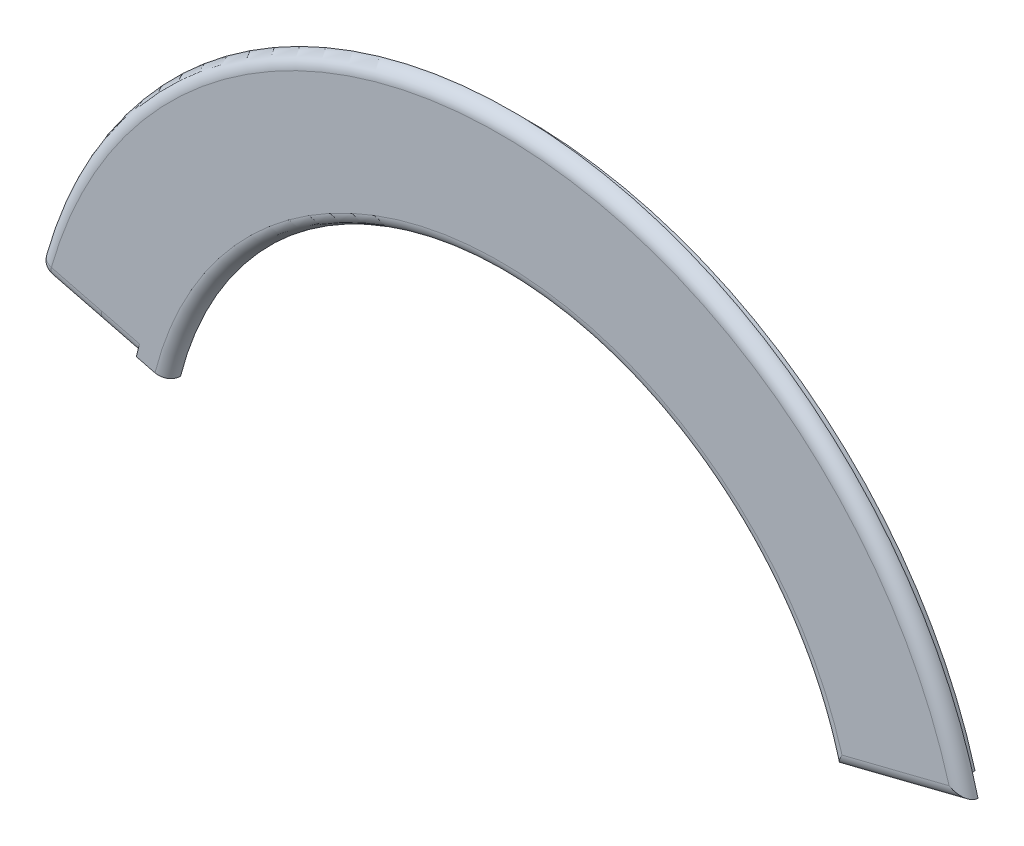
ISO-10303-21;
HEADER;
FILE_DESCRIPTION(('STEP AP214'),'2;1');
FILE_NAME('part.step','',(''),(''),'','','');
FILE_SCHEMA(('AUTOMOTIVE_DESIGN { 1 0 10303 214 1 1 1 1 }'));
ENDSEC;
DATA;
#1=APPLICATION_CONTEXT('core data for automotive mechanical design processes');
#2=APPLICATION_PROTOCOL_DEFINITION('international standard','automotive_design',2000,#1);
#3=PRODUCT_CONTEXT('',#1,'mechanical');
#4=PRODUCT('Part','Part','',(#3));
#5=PRODUCT_RELATED_PRODUCT_CATEGORY('part','',(#4));
#6=PRODUCT_DEFINITION_FORMATION('','',#4);
#7=PRODUCT_DEFINITION_CONTEXT('part definition',#1,'design');
#8=PRODUCT_DEFINITION('design','',#6,#7);
#9=PRODUCT_DEFINITION_SHAPE('','',#8);
#10=(LENGTH_UNIT() NAMED_UNIT(*) SI_UNIT(.MILLI.,.METRE.));
#11=(NAMED_UNIT(*) PLANE_ANGLE_UNIT() SI_UNIT($,.RADIAN.));
#12=(NAMED_UNIT(*) SI_UNIT($,.STERADIAN.) SOLID_ANGLE_UNIT());
#13=UNCERTAINTY_MEASURE_WITH_UNIT(LENGTH_MEASURE(1.E-05),#10,'distance_accuracy_value','');
#14=(GEOMETRIC_REPRESENTATION_CONTEXT(3) GLOBAL_UNCERTAINTY_ASSIGNED_CONTEXT((#13)) GLOBAL_UNIT_ASSIGNED_CONTEXT((#10,
#11,#12)) REPRESENTATION_CONTEXT('',''));
#15=CARTESIAN_POINT('',(0.,0.,0.));
#16=DIRECTION('',(0.,0.,1.));
#17=DIRECTION('',(1.,0.,0.));
#18=AXIS2_PLACEMENT_3D('',#15,#16,#17);
#19=CARTESIAN_POINT('',(-5.49176300543326,4.00359016784074,-7.62));
#20=DIRECTION('',(0.244398834617796,0.969674795814279,0.));
#21=DIRECTION('',(-0.969674795814279,0.244398834617796,0.));
#22=AXIS2_PLACEMENT_3D('',#19,#20,#21);
#23=PLANE('',#22);
#24=DIRECTION('',(-0.969674795814279,0.244398834617796,0.));
#25=VECTOR('',#24,1.);
#26=CARTESIAN_POINT('',(-5.49176300543326,4.00359016784074,0.));
#27=LINE('',#26,#25);
#28=CARTESIAN_POINT('',(-5.49176300543326,4.00359016784074,0.));
#29=VERTEX_POINT('',#28);
#30=CARTESIAN_POINT('',(-12.8806849495381,5.86590928762834,0.));
#31=VERTEX_POINT('',#30);
#32=EDGE_CURVE('E130',#29,#31,#27,.T.);
#33=ORIENTED_EDGE('',*,*,#32,.F.);
#34=DIRECTION('',(0.,0.,1.));
#35=VECTOR('',#34,1.);
#36=CARTESIAN_POINT('',(-5.49176300543326,4.00359016784074,-7.62));
#37=LINE('',#36,#35);
#38=CARTESIAN_POINT('',(-5.49176300543326,4.00359016784074,-7.62));
#39=VERTEX_POINT('',#38);
#40=EDGE_CURVE('E128',#39,#29,#37,.T.);
#41=ORIENTED_EDGE('',*,*,#40,.F.);
#42=DIRECTION('',(-0.969674795814279,0.244398834617796,0.));
#43=VECTOR('',#42,1.);
#44=CARTESIAN_POINT('',(-5.49176300543326,4.00359016784074,-7.62));
#45=LINE('',#44,#43);
#46=CARTESIAN_POINT('',(-12.8806849495381,5.86590928762834,-7.62));
#47=VERTEX_POINT('',#46);
#48=EDGE_CURVE('E113',#39,#47,#45,.T.);
#49=ORIENTED_EDGE('',*,*,#48,.T.);
#50=DIRECTION('',(0.,0.,1.));
#51=VECTOR('',#50,1.);
#52=CARTESIAN_POINT('',(-12.8806849495381,5.86590928762834,-7.62));
#53=LINE('',#52,#51);
#54=EDGE_CURVE('E121',#47,#31,#53,.T.);
#55=ORIENTED_EDGE('',*,*,#54,.T.);
#56=EDGE_LOOP('',(#33,#41,#49,#55));
#57=FACE_BOUND('',#56,.T.);
#58=ADVANCED_FACE('F69',(#57),#23,.T.);
#59=CARTESIAN_POINT('',(-5.49176300543326,4.00359016784074,-7.62));
#60=DIRECTION('',(-0.969674795814279,0.244398834617795,0.));
#61=DIRECTION('',(-0.244398834617795,-0.969674795814279,0.));
#62=AXIS2_PLACEMENT_3D('',#59,#60,#61);
#63=PLANE('',#62);
#64=ORIENTED_EDGE('',*,*,#40,.T.);
#65=CARTESIAN_POINT('',(-5.49176300543326,4.00359016784074,-2.54));
#66=DIRECTION('',(-0.969674795814279,0.244398834617795,0.));
#67=DIRECTION('',(-0.244398834617795,-0.969674795814279,0.));
#68=AXIS2_PLACEMENT_3D('',#65,#66,#67);
#69=CIRCLE('',#68,2.54);
#70=CARTESIAN_POINT('',(-6.11253604536246,1.54061618647247,-2.54));
#71=VERTEX_POINT('',#70);
#72=EDGE_CURVE('E13',#29,#71,#69,.F.);
#73=ORIENTED_EDGE('',*,*,#72,.T.);
#74=DIRECTION('',(0.,0.,1.));
#75=VECTOR('',#74,1.);
#76=CARTESIAN_POINT('',(-6.11253604536246,1.54061618647247,-7.62));
#77=LINE('',#76,#75);
#78=CARTESIAN_POINT('',(-6.11253604536246,1.54061618647247,-7.62));
#79=VERTEX_POINT('',#78);
#80=EDGE_CURVE('E138',#79,#71,#77,.T.);
#81=ORIENTED_EDGE('',*,*,#80,.F.);
#82=DIRECTION('',(-0.244398834617795,-0.969674795814279,0.));
#83=VECTOR('',#82,1.);
#84=CARTESIAN_POINT('',(-5.49176300543326,4.00359016784074,-7.62));
#85=LINE('',#84,#83);
#86=EDGE_CURVE('E126',#39,#79,#85,.T.);
#87=ORIENTED_EDGE('',*,*,#86,.F.);
#88=EDGE_LOOP('',(#64,#73,#81,#87));
#89=FACE_BOUND('',#88,.T.);
#90=ADVANCED_FACE('F149',(#89),#63,.F.);
#91=CARTESIAN_POINT('',(-6.11253604536246,1.54061618647247,-7.62));
#92=DIRECTION('',(0.244398834617796,0.969674795814279,0.));
#93=DIRECTION('',(-0.969674795814279,0.244398834617796,0.));
#94=AXIS2_PLACEMENT_3D('',#91,#92,#93);
#95=PLANE('',#94);
#96=ORIENTED_EDGE('',*,*,#80,.T.);
#97=DIRECTION('',(-0.969674795814279,0.244398834617796,0.));
#98=VECTOR('',#97,1.);
#99=CARTESIAN_POINT('',(-6.11253604536246,1.54061618647247,-2.54));
#100=LINE('',#99,#98);
#101=CARTESIAN_POINT('',(-13.5014579894673,3.40293530626007,-2.54));
#102=VERTEX_POINT('',#101);
#103=EDGE_CURVE('E137',#71,#102,#100,.T.);
#104=ORIENTED_EDGE('',*,*,#103,.T.);
#105=DIRECTION('',(0.,0.,1.));
#106=VECTOR('',#105,1.);
#107=CARTESIAN_POINT('',(-13.5014579894673,3.40293530626007,-7.62));
#108=LINE('',#107,#106);
#109=CARTESIAN_POINT('',(-13.5014579894673,3.40293530626007,-7.62));
#110=VERTEX_POINT('',#109);
#111=EDGE_CURVE('E125',#110,#102,#108,.T.);
#112=ORIENTED_EDGE('',*,*,#111,.F.);
#113=DIRECTION('',(-0.969674795814279,0.244398834617796,0.));
#114=VECTOR('',#113,1.);
#115=CARTESIAN_POINT('',(-6.11253604536246,1.54061618647247,-7.62));
#116=LINE('',#115,#114);
#117=EDGE_CURVE('E115',#79,#110,#116,.T.);
#118=ORIENTED_EDGE('',*,*,#117,.F.);
#119=EDGE_LOOP('',(#96,#104,#112,#118));
#120=FACE_BOUND('',#119,.T.);
#121=ADVANCED_FACE('F142',(#120),#95,.F.);
#122=CARTESIAN_POINT('',(-13.5014579894673,3.40293530626007,-7.62));
#123=DIRECTION('',(0.969674795814279,-0.244398834617795,0.));
#124=DIRECTION('',(0.244398834617795,0.969674795814279,0.));
#125=AXIS2_PLACEMENT_3D('',#122,#123,#124);
#126=PLANE('',#125);
#127=ORIENTED_EDGE('',*,*,#111,.T.);
#128=CARTESIAN_POINT('',(-12.8806849495381,5.86590928762834,-2.54));
#129=DIRECTION('',(0.969674795814279,-0.244398834617795,0.));
#130=DIRECTION('',(0.244398834617795,0.969674795814279,0.));
#131=AXIS2_PLACEMENT_3D('',#128,#129,#130);
#132=CIRCLE('',#131,2.54);
#133=EDGE_CURVE('E77',#102,#31,#132,.F.);
#134=ORIENTED_EDGE('',*,*,#133,.T.);
#135=ORIENTED_EDGE('',*,*,#54,.F.);
#136=DIRECTION('',(0.244398834617795,0.969674795814279,0.));
#137=VECTOR('',#136,1.);
#138=CARTESIAN_POINT('',(-13.5014579894673,3.40293530626007,-7.62));
#139=LINE('',#138,#137);
#140=EDGE_CURVE('E109',#110,#47,#139,.T.);
#141=ORIENTED_EDGE('',*,*,#140,.F.);
#142=EDGE_LOOP('',(#127,#134,#135,#141));
#143=FACE_BOUND('',#142,.T.);
#144=ADVANCED_FACE('F122',(#143),#126,.F.);
#145=CARTESIAN_POINT('',(0.,0.,-7.62));
#146=DIRECTION('',(0.,0.,-1.));
#147=DIRECTION('',(-1.,0.,0.));
#148=AXIS2_PLACEMENT_3D('',#145,#146,#147);
#149=PLANE('',#148);
#150=ORIENTED_EDGE('',*,*,#48,.F.);
#151=ORIENTED_EDGE('',*,*,#86,.T.);
#152=ORIENTED_EDGE('',*,*,#117,.T.);
#153=ORIENTED_EDGE('',*,*,#140,.T.);
#154=EDGE_LOOP('',(#150,#151,#152,#153));
#155=FACE_BOUND('',#154,.T.);
#156=ADVANCED_FACE('F111',(#155),#149,.T.);
#157=CARTESIAN_POINT('',(-5.49176300543326,4.00359016784074,-2.54));
#158=DIRECTION('',(-0.969674795814279,0.244398834617796,0.));
#159=DIRECTION('',(-0.244398834617796,-0.969674795814279,0.));
#160=AXIS2_PLACEMENT_3D('',#157,#158,#159);
#161=CYLINDRICAL_SURFACE('',#160,2.54);
#162=ORIENTED_EDGE('',*,*,#72,.F.);
#163=ORIENTED_EDGE('',*,*,#32,.T.);
#164=ORIENTED_EDGE('',*,*,#133,.F.);
#165=ORIENTED_EDGE('',*,*,#103,.F.);
#166=EDGE_LOOP('',(#162,#163,#164,#165));
#167=FACE_BOUND('',#166,.T.);
#168=ADVANCED_FACE('F71',(#167),#161,.T.);
#169=CLOSED_SHELL('',(#58,#90,#121,#144,#156,#168));
#170=MANIFOLD_SOLID_BREP('B2',#169);
#171=CARTESIAN_POINT('',(-12.880684949538,5.86590928762834,-2.54));
#172=DIRECTION('',(-0.969674795814278,0.2443988346178,0.));
#173=DIRECTION('',(-0.2443988346178,-0.969674795814278,0.));
#174=AXIS2_PLACEMENT_3D('',#171,#172,#173);
#175=PLANE('',#174);
#176=DIRECTION('',(0.,0.,1.));
#177=VECTOR('',#176,1.);
#178=CARTESIAN_POINT('',(-12.880684949538,5.86590928762834,-2.54));
#179=LINE('',#178,#177);
#180=CARTESIAN_POINT('',(-12.880684949538,5.86590928762835,-2.54));
#181=VERTEX_POINT('',#180);
#182=CARTESIAN_POINT('',(-12.8806849495381,5.86590928762835,0.));
#183=VERTEX_POINT('',#182);
#184=EDGE_CURVE('E398',#181,#183,#179,.T.);
#185=ORIENTED_EDGE('',*,*,#184,.T.);
#186=CARTESIAN_POINT('',(-12.880684949538,5.86590928762834,-2.54));
#187=DIRECTION('',(-0.969674795814278,0.2443988346178,0.));
#188=DIRECTION('',(-0.2443988346178,-0.969674795814278,0.));
#189=AXIS2_PLACEMENT_3D('',#186,#187,#188);
#190=CIRCLE('',#189,2.54);
#191=CARTESIAN_POINT('',(-13.5014579894673,3.40293530626007,-2.54));
#192=VERTEX_POINT('',#191);
#193=EDGE_CURVE('E407',#183,#192,#190,.F.);
#194=ORIENTED_EDGE('',*,*,#193,.T.);
#195=DIRECTION('',(-0.2443988346178,-0.969674795814278,0.));
#196=VECTOR('',#195,1.);
#197=CARTESIAN_POINT('',(-12.880684949538,5.86590928762834,-2.54));
#198=LINE('',#197,#196);
#199=EDGE_CURVE('E383',#181,#192,#198,.T.);
#200=ORIENTED_EDGE('',*,*,#199,.F.);
#201=EDGE_LOOP('',(#185,#194,#200));
#202=FACE_BOUND('',#201,.T.);
#203=ADVANCED_FACE('F193',(#202),#175,.F.);
#204=CARTESIAN_POINT('',(0.,0.,-2.54));
#205=DIRECTION('',(0.244398834617798,0.969674795814278,0.));
#206=DIRECTION('',(-0.969674795814278,0.244398834617798,0.));
#207=AXIS2_PLACEMENT_3D('',#204,#205,#206);
#208=PLANE('',#207);
#209=DIRECTION('',(-0.969674795814278,0.244398834617798,0.));
#210=VECTOR('',#209,1.);
#211=CARTESIAN_POINT('',(0.,0.,-2.54));
#212=LINE('',#211,#210);
#213=CARTESIAN_POINT('',(0.,0.,-2.54));
#214=VERTEX_POINT('',#213);
#215=CARTESIAN_POINT('',(-6.11253604536246,1.54061618647247,-2.54));
#216=VERTEX_POINT('',#215);
#217=EDGE_CURVE('E372',#214,#216,#212,.T.);
#218=ORIENTED_EDGE('',*,*,#217,.F.);
#219=CARTESIAN_POINT('',(-2.46297398136827,0.620773039929218,-2.54));
#220=DIRECTION('',(0.244398834617798,0.969674795814278,0.));
#221=DIRECTION('',(-0.969674795814278,0.244398834617798,0.));
#222=AXIS2_PLACEMENT_3D('',#219,#220,#221);
#223=CIRCLE('',#222,2.54);
#224=CARTESIAN_POINT('',(-2.46297398136829,0.620773039929211,0.));
#225=VERTEX_POINT('',#224);
#226=EDGE_CURVE('E414',#214,#225,#223,.F.);
#227=ORIENTED_EDGE('',*,*,#226,.T.);
#228=DIRECTION('',(-0.969674795814278,0.244398834617798,0.));
#229=VECTOR('',#228,1.);
#230=CARTESIAN_POINT('',(0.,0.,0.));
#231=LINE('',#230,#229);
#232=CARTESIAN_POINT('',(-6.11253604536246,1.54061618647247,0.));
#233=VERTEX_POINT('',#232);
#234=EDGE_CURVE('E369',#225,#233,#231,.T.);
#235=ORIENTED_EDGE('',*,*,#234,.T.);
#236=DIRECTION('',(0.,0.,1.));
#237=VECTOR('',#236,1.);
#238=CARTESIAN_POINT('',(-6.11253604536246,1.54061618647247,-2.54));
#239=LINE('',#238,#237);
#240=EDGE_CURVE('E402',#216,#233,#239,.T.);
#241=ORIENTED_EDGE('',*,*,#240,.F.);
#242=EDGE_LOOP('',(#218,#227,#235,#241));
#243=FACE_BOUND('',#242,.T.);
#244=ADVANCED_FACE('F442',(#243),#208,.F.);
#245=CARTESIAN_POINT('',(-6.11253604536246,1.54061618647247,-2.54));
#246=DIRECTION('',(0.969674795814278,-0.244398834617798,0.));
#247=DIRECTION('',(0.244398834617798,0.969674795814278,0.));
#248=AXIS2_PLACEMENT_3D('',#245,#246,#247);
#249=PLANE('',#248);
#250=DIRECTION('',(0.244398834617798,0.969674795814278,0.));
#251=VECTOR('',#250,1.);
#252=CARTESIAN_POINT('',(-6.11253604536246,1.54061618647247,0.));
#253=LINE('',#252,#251);
#254=CARTESIAN_POINT('',(-5.49176300543325,4.00359016784073,0.));
#255=VERTEX_POINT('',#254);
#256=EDGE_CURVE('E365',#233,#255,#253,.T.);
#257=ORIENTED_EDGE('',*,*,#256,.T.);
#258=DIRECTION('',(0.,0.,1.));
#259=VECTOR('',#258,1.);
#260=CARTESIAN_POINT('',(-5.49176300543325,4.00359016784074,-2.54));
#261=LINE('',#260,#259);
#262=CARTESIAN_POINT('',(-5.49176300543325,4.00359016784073,-2.54));
#263=VERTEX_POINT('',#262);
#264=EDGE_CURVE('E394',#263,#255,#261,.T.);
#265=ORIENTED_EDGE('',*,*,#264,.F.);
#266=DIRECTION('',(0.244398834617798,0.969674795814278,0.));
#267=VECTOR('',#266,1.);
#268=CARTESIAN_POINT('',(-6.11253604536246,1.54061618647247,-2.54));
#269=LINE('',#268,#267);
#270=EDGE_CURVE('E368',#216,#263,#269,.T.);
#271=ORIENTED_EDGE('',*,*,#270,.F.);
#272=ORIENTED_EDGE('',*,*,#240,.T.);
#273=EDGE_LOOP('',(#257,#265,#271,#272));
#274=FACE_BOUND('',#273,.T.);
#275=ADVANCED_FACE('F448',(#274),#249,.F.);
#276=CARTESIAN_POINT('',(65.1139115965482,-16.411444517581,-2.54));
#277=DIRECTION('',(0.,0.,1.));
#278=DIRECTION('',(1.,0.,0.));
#279=AXIS2_PLACEMENT_3D('',#276,#277,#278);
#280=PLANE('',#279);
#281=DIRECTION('',(-0.969674795814278,0.2443988346178,0.));
#282=VECTOR('',#281,1.);
#283=CARTESIAN_POINT('',(-13.5014579894673,3.40293530626007,-2.54));
#284=LINE('',#283,#282);
#285=CARTESIAN_POINT('',(-23.3639783500367,5.88870527050193,-2.54));
#286=VERTEX_POINT('',#285);
#287=EDGE_CURVE('E380',#192,#286,#284,.T.);
#288=ORIENTED_EDGE('',*,*,#287,.T.);
#289=CARTESIAN_POINT('',(-22.7432053101074,8.3516792518702,-2.54));
#290=DIRECTION('',(0.,0.,1.));
#291=DIRECTION('',(1.,0.,0.));
#292=AXIS2_PLACEMENT_3D('',#289,#290,#291);
#293=CIRCLE('',#292,2.54);
#294=CARTESIAN_POINT('',(-25.1879516841023,9.04074758435909,-2.54));
#295=VERTEX_POINT('',#294);
#296=EDGE_CURVE('E412',#286,#295,#293,.F.);
#297=ORIENTED_EDGE('',*,*,#296,.T.);
#298=CARTESIAN_POINT('',(65.1139115965482,-16.411444517581,-2.54));
#299=DIRECTION('',(0.,0.,-1.));
#300=DIRECTION('',(-1.,0.,0.));
#301=AXIS2_PLACEMENT_3D('',#298,#299,#300);
#302=CIRCLE('',#301,93.8202568465433);
#303=CARTESIAN_POINT('',(156.089049997463,6.51811691925664,-2.54));
#304=VERTEX_POINT('',#303);
#305=EDGE_CURVE('E378',#295,#304,#302,.T.);
#306=ORIENTED_EDGE('',*,*,#305,.T.);
#307=DIRECTION('',(-0.969674795814278,-0.244398834617797,0.));
#308=VECTOR('',#307,1.);
#309=CARTESIAN_POINT('',(130.227823193096,0.,-2.54));
#310=LINE('',#309,#308);
#311=CARTESIAN_POINT('',(130.227823193096,0.,-2.54));
#312=VERTEX_POINT('',#311);
#313=EDGE_CURVE('E376',#304,#312,#310,.T.);
#314=ORIENTED_EDGE('',*,*,#313,.T.);
#315=CARTESIAN_POINT('',(65.1139115965482,-16.411444517581,-2.54));
#316=DIRECTION('',(0.,0.,1.));
#317=DIRECTION('',(-1.,0.,0.));
#318=AXIS2_PLACEMENT_3D('',#315,#316,#317);
#319=CIRCLE('',#318,67.1502568465433);
#320=EDGE_CURVE('E374',#312,#214,#319,.T.);
#321=ORIENTED_EDGE('',*,*,#320,.T.);
#322=ORIENTED_EDGE('',*,*,#217,.T.);
#323=ORIENTED_EDGE('',*,*,#270,.T.);
#324=DIRECTION('',(-0.969674795814278,0.244398834617798,0.));
#325=VECTOR('',#324,1.);
#326=CARTESIAN_POINT('',(0.620773039929206,2.46297398136827,-2.54));
#327=LINE('',#326,#325);
#328=CARTESIAN_POINT('',(-1.79730203338088,3.07243060794693,-2.54));
#329=VERTEX_POINT('',#328);
#330=EDGE_CURVE('E366',#329,#263,#327,.T.);
#331=ORIENTED_EDGE('',*,*,#330,.F.);
#332=CARTESIAN_POINT('',(65.1139115965482,-16.411444517581,-2.54));
#333=DIRECTION('',(0.,0.,1.));
#334=DIRECTION('',(1.,0.,0.));
#335=AXIS2_PLACEMENT_3D('',#332,#333,#334);
#336=CIRCLE('',#335,69.6902568465433);
#337=CARTESIAN_POINT('',(132.025125226477,3.07243060794694,-2.54));
#338=VERTEX_POINT('',#337);
#339=EDGE_CURVE('E392',#338,#329,#336,.T.);
#340=ORIENTED_EDGE('',*,*,#339,.F.);
#341=DIRECTION('',(-0.969674795814279,-0.244398834617797,0.));
#342=VECTOR('',#341,1.);
#343=CARTESIAN_POINT('',(129.607050153167,2.46297398136827,-2.54));
#344=LINE('',#343,#342);
#345=CARTESIAN_POINT('',(152.971028503204,8.35167925187016,-2.54));
#346=VERTEX_POINT('',#345);
#347=EDGE_CURVE('E390',#346,#338,#344,.T.);
#348=ORIENTED_EDGE('',*,*,#347,.F.);
#349=CARTESIAN_POINT('',(65.1139115965482,-16.411444517581,-2.54));
#350=DIRECTION('',(0.,0.,1.));
#351=DIRECTION('',(1.,0.,0.));
#352=AXIS2_PLACEMENT_3D('',#349,#350,#351);
#353=CIRCLE('',#352,91.2802568465433);
#354=CARTESIAN_POINT('',(-22.7432053101075,8.35167925187018,-2.54));
#355=VERTEX_POINT('',#354);
#356=EDGE_CURVE('E388',#355,#346,#353,.F.);
#357=ORIENTED_EDGE('',*,*,#356,.F.);
#358=DIRECTION('',(-0.969674795814278,0.2443988346178,0.));
#359=VECTOR('',#358,1.);
#360=CARTESIAN_POINT('',(-12.880684949538,5.86590928762834,-2.54));
#361=LINE('',#360,#359);
#362=EDGE_CURVE('E386',#181,#355,#361,.T.);
#363=ORIENTED_EDGE('',*,*,#362,.F.);
#364=ORIENTED_EDGE('',*,*,#199,.T.);
#365=EDGE_LOOP('',(#288,#297,#306,#314,#321,#322,#323,#331,#340,#348,#357,#363,#364));
#366=FACE_BOUND('',#365,.T.);
#367=ADVANCED_FACE('F457',(#366),#280,.F.);
#368=CARTESIAN_POINT('',(65.1139115965482,-16.411444517581,0.));
#369=DIRECTION('',(0.,0.,1.));
#370=DIRECTION('',(1.,0.,0.));
#371=AXIS2_PLACEMENT_3D('',#368,#369,#370);
#372=PLANE('',#371);
#373=ORIENTED_EDGE('',*,*,#234,.F.);
#374=CARTESIAN_POINT('',(65.1139115965482,-16.411444517581,0.));
#375=DIRECTION('',(0.,0.,1.));
#376=DIRECTION('',(1.,0.,0.));
#377=AXIS2_PLACEMENT_3D('',#374,#375,#376);
#378=CIRCLE('',#377,69.6902568465433);
#379=CARTESIAN_POINT('',(132.025125226477,3.07243060794694,0.));
#380=VERTEX_POINT('',#379);
#381=EDGE_CURVE('E67',#225,#380,#378,.F.);
#382=ORIENTED_EDGE('',*,*,#381,.T.);
#383=DIRECTION('',(-0.969674795814279,-0.244398834617797,0.));
#384=VECTOR('',#383,1.);
#385=CARTESIAN_POINT('',(155.468276957534,8.98109090062491,0.));
#386=LINE('',#385,#384);
#387=CARTESIAN_POINT('',(152.971028503204,8.35167925187016,0.));
#388=VERTEX_POINT('',#387);
#389=EDGE_CURVE('E208',#380,#388,#386,.F.);
#390=ORIENTED_EDGE('',*,*,#389,.T.);
#391=CARTESIAN_POINT('',(65.1139115965482,-16.411444517581,0.));
#392=DIRECTION('',(0.,0.,1.));
#393=DIRECTION('',(1.,0.,0.));
#394=AXIS2_PLACEMENT_3D('',#391,#392,#393);
#395=CIRCLE('',#394,91.2802568465433);
#396=CARTESIAN_POINT('',(-22.7432053101074,8.3516792518702,0.));
#397=VERTEX_POINT('',#396);
#398=EDGE_CURVE('E416',#388,#397,#395,.T.);
#399=ORIENTED_EDGE('',*,*,#398,.T.);
#400=DIRECTION('',(-0.969674795814278,0.2443988346178,0.));
#401=VECTOR('',#400,1.);
#402=CARTESIAN_POINT('',(-12.880684949538,5.86590928762834,0.));
#403=LINE('',#402,#401);
#404=EDGE_CURVE('E401',#397,#183,#403,.F.);
#405=ORIENTED_EDGE('',*,*,#404,.T.);
#406=DIRECTION('',(-0.969674795814279,0.244398834617797,0.));
#407=VECTOR('',#406,1.);
#408=CARTESIAN_POINT('',(-1.79730203338088,3.07243060794693,0.));
#409=LINE('',#408,#407);
#410=EDGE_CURVE('E334',#255,#183,#409,.T.);
#411=ORIENTED_EDGE('',*,*,#410,.F.);
#412=ORIENTED_EDGE('',*,*,#256,.F.);
#413=EDGE_LOOP('',(#373,#382,#390,#399,#405,#411,#412));
#414=FACE_BOUND('',#413,.T.);
#415=ADVANCED_FACE('F452',(#414),#372,.T.);
#416=CARTESIAN_POINT('',(-1.79730203338088,3.07243060794693,-5.08));
#417=DIRECTION('',(0.244398834617797,0.969674795814279,0.));
#418=DIRECTION('',(-0.969674795814279,0.244398834617797,0.));
#419=AXIS2_PLACEMENT_3D('',#416,#417,#418);
#420=PLANE('',#419);
#421=ORIENTED_EDGE('',*,*,#330,.T.);
#422=ORIENTED_EDGE('',*,*,#264,.T.);
#423=ORIENTED_EDGE('',*,*,#410,.T.);
#424=ORIENTED_EDGE('',*,*,#184,.F.);
#425=ORIENTED_EDGE('',*,*,#362,.T.);
#426=DIRECTION('',(0.,0.,1.));
#427=VECTOR('',#426,1.);
#428=CARTESIAN_POINT('',(-22.7432053101075,8.35167925187018,-5.08));
#429=LINE('',#428,#427);
#430=CARTESIAN_POINT('',(-22.7432053101075,8.35167925187018,-5.08));
#431=VERTEX_POINT('',#430);
#432=EDGE_CURVE('E362',#431,#355,#429,.T.);
#433=ORIENTED_EDGE('',*,*,#432,.F.);
#434=DIRECTION('',(-0.969674795814279,0.244398834617797,0.));
#435=VECTOR('',#434,1.);
#436=CARTESIAN_POINT('',(-1.79730203338088,3.07243060794693,-5.08));
#437=LINE('',#436,#435);
#438=CARTESIAN_POINT('',(-1.79730203338088,3.07243060794693,-5.08));
#439=VERTEX_POINT('',#438);
#440=EDGE_CURVE('E337',#439,#431,#437,.T.);
#441=ORIENTED_EDGE('',*,*,#440,.F.);
#442=DIRECTION('',(0.,0.,1.));
#443=VECTOR('',#442,1.);
#444=CARTESIAN_POINT('',(-1.79730203338088,3.07243060794693,-5.08));
#445=LINE('',#444,#443);
#446=EDGE_CURVE('E352',#439,#329,#445,.T.);
#447=ORIENTED_EDGE('',*,*,#446,.T.);
#448=EDGE_LOOP('',(#421,#422,#423,#424,#425,#433,#441,#447));
#449=FACE_BOUND('',#448,.T.);
#450=ADVANCED_FACE('F491',(#449),#420,.F.);
#451=CARTESIAN_POINT('',(65.1139115965482,-16.411444517581,-5.08));
#452=DIRECTION('',(0.,0.,1.));
#453=DIRECTION('',(1.,0.,0.));
#454=AXIS2_PLACEMENT_3D('',#451,#452,#453);
#455=CYLINDRICAL_SURFACE('',#454,91.2802568465433);
#456=ORIENTED_EDGE('',*,*,#432,.T.);
#457=ORIENTED_EDGE('',*,*,#356,.T.);
#458=DIRECTION('',(0.,0.,1.));
#459=VECTOR('',#458,1.);
#460=CARTESIAN_POINT('',(152.971028503204,8.35167925187016,-5.08));
#461=LINE('',#460,#459);
#462=CARTESIAN_POINT('',(152.971028503204,8.35167925187016,-5.08));
#463=VERTEX_POINT('',#462);
#464=EDGE_CURVE('E359',#463,#346,#461,.T.);
#465=ORIENTED_EDGE('',*,*,#464,.F.);
#466=CARTESIAN_POINT('',(65.1139115965482,-16.411444517581,-5.08));
#467=DIRECTION('',(0.,0.,-1.));
#468=DIRECTION('',(-1.,0.,0.));
#469=AXIS2_PLACEMENT_3D('',#466,#467,#468);
#470=CIRCLE('',#469,91.2802568465433);
#471=EDGE_CURVE('E345',#431,#463,#470,.T.);
#472=ORIENTED_EDGE('',*,*,#471,.F.);
#473=EDGE_LOOP('',(#456,#457,#465,#472));
#474=FACE_BOUND('',#473,.T.);
#475=ADVANCED_FACE('F505',(#474),#455,.T.);
#476=CARTESIAN_POINT('',(132.025125226477,3.07243060794694,-5.08));
#477=DIRECTION('',(0.244398834617797,-0.969674795814279,0.));
#478=DIRECTION('',(0.969674795814279,0.244398834617797,0.));
#479=AXIS2_PLACEMENT_3D('',#476,#477,#478);
#480=PLANE('',#479);
#481=ORIENTED_EDGE('',*,*,#347,.T.);
#482=DIRECTION('',(0.,0.,1.));
#483=VECTOR('',#482,1.);
#484=CARTESIAN_POINT('',(132.025125226477,3.07243060794694,-5.08));
#485=LINE('',#484,#483);
#486=CARTESIAN_POINT('',(132.025125226477,3.07243060794694,-5.08));
#487=VERTEX_POINT('',#486);
#488=EDGE_CURVE('E356',#487,#338,#485,.T.);
#489=ORIENTED_EDGE('',*,*,#488,.F.);
#490=DIRECTION('',(0.969674795814278,0.244398834617797,0.));
#491=VECTOR('',#490,1.);
#492=CARTESIAN_POINT('',(132.025125226477,3.07243060794694,-5.08));
#493=LINE('',#492,#491);
#494=EDGE_CURVE('E347',#487,#463,#493,.T.);
#495=ORIENTED_EDGE('',*,*,#494,.T.);
#496=ORIENTED_EDGE('',*,*,#464,.T.);
#497=EDGE_LOOP('',(#481,#489,#495,#496));
#498=FACE_BOUND('',#497,.T.);
#499=ADVANCED_FACE('F499',(#498),#480,.T.);
#500=CARTESIAN_POINT('',(65.1139115965482,-16.411444517581,-5.08));
#501=DIRECTION('',(0.,0.,1.));
#502=DIRECTION('',(1.,0.,0.));
#503=AXIS2_PLACEMENT_3D('',#500,#501,#502);
#504=CYLINDRICAL_SURFACE('',#503,69.6902568465433);
#505=ORIENTED_EDGE('',*,*,#339,.T.);
#506=ORIENTED_EDGE('',*,*,#446,.F.);
#507=CARTESIAN_POINT('',(65.1139115965482,-16.411444517581,-5.08));
#508=DIRECTION('',(0.,0.,-1.));
#509=DIRECTION('',(-1.,0.,0.));
#510=AXIS2_PLACEMENT_3D('',#507,#508,#509);
#511=CIRCLE('',#510,69.6902568465433);
#512=EDGE_CURVE('E350',#439,#487,#511,.T.);
#513=ORIENTED_EDGE('',*,*,#512,.T.);
#514=ORIENTED_EDGE('',*,*,#488,.T.);
#515=EDGE_LOOP('',(#505,#506,#513,#514));
#516=FACE_BOUND('',#515,.T.);
#517=ADVANCED_FACE('F496',(#516),#504,.F.);
#518=CARTESIAN_POINT('',(65.1139115965482,-16.411444517581,-5.08));
#519=DIRECTION('',(0.,0.,-1.));
#520=DIRECTION('',(-1.,0.,0.));
#521=AXIS2_PLACEMENT_3D('',#518,#519,#520);
#522=PLANE('',#521);
#523=ORIENTED_EDGE('',*,*,#440,.T.);
#524=ORIENTED_EDGE('',*,*,#471,.T.);
#525=ORIENTED_EDGE('',*,*,#494,.F.);
#526=ORIENTED_EDGE('',*,*,#512,.F.);
#527=EDGE_LOOP('',(#523,#524,#525,#526));
#528=FACE_BOUND('',#527,.T.);
#529=CARTESIAN_POINT('',(65.1139115965482,-16.411444517581,-5.08));
#530=DIRECTION('',(0.,0.,-1.));
#531=DIRECTION('',(-1.,0.,0.));
#532=AXIS2_PLACEMENT_3D('',#529,#530,#531);
#533=CIRCLE('',#532,88.7402568465433);
#534=CARTESIAN_POINT('',(-19.5526223378407,10.166953039974,-5.08));
#535=VERTEX_POINT('',#534);
#536=CARTESIAN_POINT('',(149.780445530937,10.166953039974,-5.08));
#537=VERTEX_POINT('',#536);
#538=EDGE_CURVE('E550',#535,#537,#533,.T.);
#539=ORIENTED_EDGE('',*,*,#538,.F.);
#540=DIRECTION('',(-0.969674795814278,0.244398834617797,0.));
#541=VECTOR('',#540,1.);
#542=CARTESIAN_POINT('',(-3.5109646146535,6.12378055595348,-5.08));
#543=LINE('',#542,#541);
#544=CARTESIAN_POINT('',(-3.51096461465351,6.12378055595348,-5.08));
#545=VERTEX_POINT('',#544);
#546=EDGE_CURVE('E333',#545,#535,#543,.T.);
#547=ORIENTED_EDGE('',*,*,#546,.F.);
#548=CARTESIAN_POINT('',(65.1139115965482,-16.411444517581,-5.08));
#549=DIRECTION('',(0.,0.,-1.));
#550=DIRECTION('',(-1.,0.,0.));
#551=AXIS2_PLACEMENT_3D('',#548,#549,#550);
#552=CIRCLE('',#551,72.2302568465433);
#553=CARTESIAN_POINT('',(133.73878780775,6.1237805559535,-5.08));
#554=VERTEX_POINT('',#553);
#555=EDGE_CURVE('E543',#545,#554,#552,.T.);
#556=ORIENTED_EDGE('',*,*,#555,.T.);
#557=DIRECTION('',(0.969674795814278,0.244398834617797,0.));
#558=VECTOR('',#557,1.);
#559=CARTESIAN_POINT('',(133.73878780775,6.12378055595348,-5.08));
#560=LINE('',#559,#558);
#561=EDGE_CURVE('E545',#554,#537,#560,.T.);
#562=ORIENTED_EDGE('',*,*,#561,.T.);
#563=EDGE_LOOP('',(#539,#547,#556,#562));
#564=FACE_BOUND('',#563,.T.);
#565=ADVANCED_FACE('F501',(#528,#564),#522,.T.);
#566=CARTESIAN_POINT('',(-3.5109646146535,6.12378055595348,-5.08));
#567=DIRECTION('',(0.244398834617797,0.969674795814278,0.));
#568=DIRECTION('',(-0.969674795814279,0.244398834617797,0.));
#569=AXIS2_PLACEMENT_3D('',#566,#567,#568);
#570=PLANE('',#569);
#571=DIRECTION('',(-0.969674795814278,0.244398834617797,0.));
#572=VECTOR('',#571,1.);
#573=CARTESIAN_POINT('',(-3.5109646146535,6.12378055595348,-2.54));
#574=LINE('',#573,#572);
#575=CARTESIAN_POINT('',(-3.51096461465351,6.12378055595348,-2.54));
#576=VERTEX_POINT('',#575);
#577=CARTESIAN_POINT('',(-19.5526223378407,10.166953039974,-2.54));
#578=VERTEX_POINT('',#577);
#579=EDGE_CURVE('E310',#576,#578,#574,.T.);
#580=ORIENTED_EDGE('',*,*,#579,.F.);
#581=DIRECTION('',(0.,0.,1.));
#582=VECTOR('',#581,1.);
#583=CARTESIAN_POINT('',(-3.51096461465351,6.12378055595348,-5.08));
#584=LINE('',#583,#582);
#585=EDGE_CURVE('E539',#545,#576,#584,.T.);
#586=ORIENTED_EDGE('',*,*,#585,.F.);
#587=ORIENTED_EDGE('',*,*,#546,.T.);
#588=DIRECTION('',(0.,0.,1.));
#589=VECTOR('',#588,1.);
#590=CARTESIAN_POINT('',(-19.5526223378407,10.166953039974,-5.08));
#591=LINE('',#590,#589);
#592=EDGE_CURVE('E325',#535,#578,#591,.T.);
#593=ORIENTED_EDGE('',*,*,#592,.T.);
#594=EDGE_LOOP('',(#580,#586,#587,#593));
#595=FACE_BOUND('',#594,.T.);
#596=ADVANCED_FACE('F331',(#595),#570,.T.);
#597=CARTESIAN_POINT('',(65.1139115965482,-16.411444517581,-5.08));
#598=DIRECTION('',(0.,0.,1.));
#599=DIRECTION('',(1.,0.,0.));
#600=AXIS2_PLACEMENT_3D('',#597,#598,#599);
#601=CYLINDRICAL_SURFACE('',#600,88.7402568465433);
#602=CARTESIAN_POINT('',(65.1139115965482,-16.411444517581,-2.54));
#603=DIRECTION('',(0.,0.,-1.));
#604=DIRECTION('',(-1.,0.,0.));
#605=AXIS2_PLACEMENT_3D('',#602,#603,#604);
#606=CIRCLE('',#605,88.7402568465433);
#607=CARTESIAN_POINT('',(149.780445530937,10.166953039974,-2.54));
#608=VERTEX_POINT('',#607);
#609=EDGE_CURVE('E313',#578,#608,#606,.T.);
#610=ORIENTED_EDGE('',*,*,#609,.F.);
#611=ORIENTED_EDGE('',*,*,#592,.F.);
#612=ORIENTED_EDGE('',*,*,#538,.T.);
#613=DIRECTION('',(0.,0.,1.));
#614=VECTOR('',#613,1.);
#615=CARTESIAN_POINT('',(149.780445530937,10.166953039974,-5.08));
#616=LINE('',#615,#614);
#617=EDGE_CURVE('E328',#537,#608,#616,.T.);
#618=ORIENTED_EDGE('',*,*,#617,.T.);
#619=EDGE_LOOP('',(#610,#611,#612,#618));
#620=FACE_BOUND('',#619,.T.);
#621=ADVANCED_FACE('F324',(#620),#601,.F.);
#622=CARTESIAN_POINT('',(133.73878780775,6.12378055595348,-5.08));
#623=DIRECTION('',(0.244398834617797,-0.969674795814278,0.));
#624=DIRECTION('',(0.969674795814279,0.244398834617797,0.));
#625=AXIS2_PLACEMENT_3D('',#622,#623,#624);
#626=PLANE('',#625);
#627=DIRECTION('',(0.,0.,1.));
#628=VECTOR('',#627,1.);
#629=CARTESIAN_POINT('',(133.73878780775,6.1237805559535,-5.08));
#630=LINE('',#629,#628);
#631=CARTESIAN_POINT('',(133.73878780775,6.1237805559535,-2.54));
#632=VERTEX_POINT('',#631);
#633=EDGE_CURVE('E339',#554,#632,#630,.T.);
#634=ORIENTED_EDGE('',*,*,#633,.T.);
#635=DIRECTION('',(0.969674795814278,0.244398834617797,0.));
#636=VECTOR('',#635,1.);
#637=CARTESIAN_POINT('',(133.73878780775,6.12378055595348,-2.54));
#638=LINE('',#637,#636);
#639=EDGE_CURVE('E329',#632,#608,#638,.T.);
#640=ORIENTED_EDGE('',*,*,#639,.T.);
#641=ORIENTED_EDGE('',*,*,#617,.F.);
#642=ORIENTED_EDGE('',*,*,#561,.F.);
#643=EDGE_LOOP('',(#634,#640,#641,#642));
#644=FACE_BOUND('',#643,.T.);
#645=ADVANCED_FACE('F530',(#644),#626,.F.);
#646=CARTESIAN_POINT('',(65.1139115965482,-16.411444517581,-5.08));
#647=DIRECTION('',(0.,0.,1.));
#648=DIRECTION('',(1.,0.,0.));
#649=AXIS2_PLACEMENT_3D('',#646,#647,#648);
#650=CYLINDRICAL_SURFACE('',#649,72.2302568465433);
#651=ORIENTED_EDGE('',*,*,#585,.T.);
#652=CARTESIAN_POINT('',(65.1139115965482,-16.411444517581,-2.54));
#653=DIRECTION('',(0.,0.,-1.));
#654=DIRECTION('',(-1.,0.,0.));
#655=AXIS2_PLACEMENT_3D('',#652,#653,#654);
#656=CIRCLE('',#655,72.2302568465433);
#657=EDGE_CURVE('E316',#576,#632,#656,.T.);
#658=ORIENTED_EDGE('',*,*,#657,.T.);
#659=ORIENTED_EDGE('',*,*,#633,.F.);
#660=ORIENTED_EDGE('',*,*,#555,.F.);
#661=EDGE_LOOP('',(#651,#658,#659,#660));
#662=FACE_BOUND('',#661,.T.);
#663=ADVANCED_FACE('F467',(#662),#650,.T.);
#664=CARTESIAN_POINT('',(65.1139115965482,-16.411444517581,-2.54));
#665=DIRECTION('',(0.,0.,-1.));
#666=DIRECTION('',(-1.,0.,0.));
#667=AXIS2_PLACEMENT_3D('',#664,#665,#666);
#668=PLANE('',#667);
#669=ORIENTED_EDGE('',*,*,#579,.T.);
#670=ORIENTED_EDGE('',*,*,#609,.T.);
#671=ORIENTED_EDGE('',*,*,#639,.F.);
#672=ORIENTED_EDGE('',*,*,#657,.F.);
#673=EDGE_LOOP('',(#669,#670,#671,#672));
#674=FACE_BOUND('',#673,.T.);
#675=ADVANCED_FACE('F312',(#674),#668,.T.);
#676=CARTESIAN_POINT('',(-12.880684949538,5.86590928762834,-2.54));
#677=DIRECTION('',(0.969674795814278,-0.2443988346178,0.));
#678=DIRECTION('',(0.2443988346178,0.969674795814278,0.));
#679=AXIS2_PLACEMENT_3D('',#676,#677,#678);
#680=CYLINDRICAL_SURFACE('',#679,2.54);
#681=ORIENTED_EDGE('',*,*,#404,.F.);
#682=CARTESIAN_POINT('',(-22.7432053101074,8.3516792518702,-2.54));
#683=DIRECTION('',(0.969674795814278,-0.2443988346178,0.));
#684=DIRECTION('',(0.2443988346178,0.969674795814278,0.));
#685=AXIS2_PLACEMENT_3D('',#682,#683,#684);
#686=CIRCLE('',#685,2.54);
#687=EDGE_CURVE('E409',#397,#286,#686,.T.);
#688=ORIENTED_EDGE('',*,*,#687,.T.);
#689=ORIENTED_EDGE('',*,*,#287,.F.);
#690=ORIENTED_EDGE('',*,*,#193,.F.);
#691=EDGE_LOOP('',(#681,#688,#689,#690));
#692=FACE_BOUND('',#691,.T.);
#693=ADVANCED_FACE('F459',(#692),#680,.T.);
#694=CARTESIAN_POINT('',(65.1139115965482,-16.411444517581,-2.54));
#695=DIRECTION('',(0.,0.,1.));
#696=DIRECTION('',(1.,0.,0.));
#697=AXIS2_PLACEMENT_3D('',#694,#695,#696);
#698=TOROIDAL_SURFACE('',#697,69.6902568465433,2.54);
#699=ORIENTED_EDGE('',*,*,#226,.F.);
#700=ORIENTED_EDGE('',*,*,#320,.F.);
#701=CARTESIAN_POINT('',(130.227823193096,0.,-2.54));
#702=CARTESIAN_POINT('',(130.227812499294,-1.74388607065322E-05,-2.48294524478048));
#703=CARTESIAN_POINT('',(130.229217089101,0.00233331769151429,-2.42590166588202));
#704=CARTESIAN_POINT('',(130.234774523778,0.0116368303420594,-2.31237022446915));
#705=CARTESIAN_POINT('',(130.238925175198,0.0185859134733814,-2.25588195491203));
#706=CARTESIAN_POINT('',(130.249845535087,0.0368731626452191,-2.14438306821168));
#707=CARTESIAN_POINT('',(130.256592429466,0.0481730967412676,-2.08936392428889));
#708=CARTESIAN_POINT('',(130.272558914917,0.074923057042618,-1.98072062713745));
#709=CARTESIAN_POINT('',(130.281778868532,0.0903736917285016,-1.92709667970576));
#710=CARTESIAN_POINT('',(130.312834536967,0.14243725514493,-1.76917825671416));
#711=CARTESIAN_POINT('',(130.338110519775,0.184836186689582,-1.66740315316459));
#712=CARTESIAN_POINT('',(130.396277816972,0.282522045811407,-1.47250644189016));
#713=CARTESIAN_POINT('',(130.429186577459,0.337838500740639,-1.37940535411825));
#714=CARTESIAN_POINT('',(130.515875820724,0.483757408458235,-1.16636368045719));
#715=CARTESIAN_POINT('',(130.57266928889,0.579507891925174,-1.05116936743684));
#716=CARTESIAN_POINT('',(130.694703764535,0.785727638770116,-0.840111438538479));
#717=CARTESIAN_POINT('',(130.759960843056,0.896224915832422,-0.744285509141163));
#718=CARTESIAN_POINT('',(130.921993417633,1.17128109228204,-0.538502408510772));
#719=CARTESIAN_POINT('',(131.021371618226,1.34050839022186,-0.436853219743527));
#720=CARTESIAN_POINT('',(131.226426981136,1.69099794639863,-0.266147062988985));
#721=CARTESIAN_POINT('',(131.332110921405,1.87227317952194,-0.197125903992183));
#722=CARTESIAN_POINT('',(131.534788715129,2.22125148815295,-0.0957040073948418));
#723=CARTESIAN_POINT('',(131.631451312595,2.38823891466227,-0.0600979018838315));
#724=CARTESIAN_POINT('',(131.825560067564,2.72471856849894,-0.0124768556974932));
#725=CARTESIAN_POINT('',(131.923004124297,2.89420472119228,-0.000411960042365344));
#726=CARTESIAN_POINT('',(132.021783561195,3.06659810270259,-3.46057519436771E-06));
#727=CARTESIAN_POINT('',(132.023454445632,3.0695143603156,-3.71208108352621E-09));
#728=CARTESIAN_POINT('',(132.025125226477,3.07243060794694,0.));
#729=B_SPLINE_CURVE_WITH_KNOTS('',3,(#701,#702,#703,#704,#705,#706,#707,#708,#709,#710,#711,
#712,#713,#714,#715,#716,#717,#718,#719,#720,#721,#722,#723,#724,#725,#726,#727,#728),
.UNSPECIFIED.,.F.,.F.,(4,2,2,2,2,2,2,2,2,2,2,2,2,4),(0.,0.171080402191863,0.342024316604393,
0.511499179637386,0.680998900760604,1.01868838856157,1.35715746884705,1.8350812054512,
2.31392610587305,2.97342578762191,3.63364759396487,4.22086615202602,4.80683725799876,
4.8169202960717),.UNSPECIFIED.);
#730=EDGE_CURVE('E198',#380,#312,#729,.F.);
#731=ORIENTED_EDGE('',*,*,#730,.F.);
#732=ORIENTED_EDGE('',*,*,#381,.F.);
#733=EDGE_LOOP('',(#699,#700,#731,#732));
#734=FACE_BOUND('',#733,.T.);
#735=ADVANCED_FACE('F195',(#734),#698,.T.);
#736=CARTESIAN_POINT('',(129.607050153167,2.46297398136827,-2.54));
#737=DIRECTION('',(0.969674795814279,0.244398834617797,0.));
#738=DIRECTION('',(-0.244398834617797,0.969674795814279,0.));
#739=AXIS2_PLACEMENT_3D('',#736,#737,#738);
#740=CYLINDRICAL_SURFACE('',#739,2.54);
#741=ORIENTED_EDGE('',*,*,#730,.T.);
#742=ORIENTED_EDGE('',*,*,#313,.F.);
#743=CARTESIAN_POINT('',(156.089049997463,6.51811691925664,-2.54));
#744=CARTESIAN_POINT('',(156.089066961523,6.51810658934364,-2.48310496676394));
#745=CARTESIAN_POINT('',(156.086729708887,6.51950303334604,-2.42622072105202));
#746=CARTESIAN_POINT('',(156.077477421458,6.52502998204918,-2.31300225290163));
#747=CARTESIAN_POINT('',(156.070565915955,6.52915837889628,-2.2566676403679));
#748=CARTESIAN_POINT('',(156.052372352138,6.54002401603657,-2.14545804019369));
#749=CARTESIAN_POINT('',(156.041127597325,6.54673898915385,-2.09057475490231));
#750=CARTESIAN_POINT('',(156.014501317387,6.56263556306708,-1.98219634831769));
#751=CARTESIAN_POINT('',(155.999119213171,6.57181750915659,-1.92870142249853));
#752=CARTESIAN_POINT('',(155.947267815459,6.60275991735245,-1.77114763521417));
#753=CARTESIAN_POINT('',(155.905021774828,6.62795979313272,-1.6695998749977));
#754=CARTESIAN_POINT('',(155.807639911667,6.68599972480216,-1.47516915010695));
#755=CARTESIAN_POINT('',(155.752475415315,6.71885677576985,-1.38230611320932));
#756=CARTESIAN_POINT('',(155.607345286025,6.80521235924931,-1.17050945687391));
#757=CARTESIAN_POINT('',(155.512331905683,6.86168230740476,-1.05624093168467));
#758=CARTESIAN_POINT('',(155.30774060339,6.98307468984892,-0.84691314399017));
#759=CARTESIAN_POINT('',(155.198135343771,7.04801298466647,-0.751890802709408));
#760=CARTESIAN_POINT('',(154.923719188287,7.21029773669943,-0.546542592208114));
#761=CARTESIAN_POINT('',(154.754106467034,7.31037168263702,-0.444812318508836));
#762=CARTESIAN_POINT('',(154.402982305034,7.51695913510523,-0.273884554813513));
#763=CARTESIAN_POINT('',(154.221455743983,7.623480810833,-0.204729353663541));
#764=CARTESIAN_POINT('',(153.864145395407,7.83254291009424,-0.100139203754053));
#765=CARTESIAN_POINT('',(153.688794521839,7.93487034673126,-0.0627517487403165));
#766=CARTESIAN_POINT('',(153.33553120827,8.14044658456889,-0.0129105690464236));
#767=CARTESIAN_POINT('',(153.157624746978,8.24369307078929,-0.000405958471680136));
#768=CARTESIAN_POINT('',(152.976845747225,8.34831294591626,-3.24649100949661E-06));
#769=CARTESIAN_POINT('',(152.973937117126,8.3499961422366,-4.92995242777913E-09));
#770=CARTESIAN_POINT('',(152.971028503204,8.35167925187016,0.));
#771=B_SPLINE_CURVE_WITH_KNOTS('',3,(#743,#744,#745,#746,#747,#748,#749,#750,#751,#752,#753,
#754,#755,#756,#757,#758,#759,#760,#761,#762,#763,#764,#765,#766,#767,#768,#769,#770),
.UNSPECIFIED.,.F.,.F.,(4,2,2,2,2,2,2,2,2,2,2,2,2,4),(0.,0.170602426016603,0.341073376000577,
0.51010844977957,0.679167195141941,1.01601764599866,1.35362297830107,1.82790226712751,
2.30308295499079,2.96447879459608,3.62673090559888,4.24451222953078,4.86102887507122,
4.87111051443867),.UNSPECIFIED.);
#772=EDGE_CURVE('E421',#388,#304,#771,.F.);
#773=ORIENTED_EDGE('',*,*,#772,.F.);
#774=ORIENTED_EDGE('',*,*,#389,.F.);
#775=EDGE_LOOP('',(#741,#742,#773,#774));
#776=FACE_BOUND('',#775,.T.);
#777=ADVANCED_FACE('F427',(#776),#740,.T.);
#778=CARTESIAN_POINT('',(65.1139115965482,-16.411444517581,-2.54));
#779=DIRECTION('',(0.,0.,1.));
#780=DIRECTION('',(1.,0.,0.));
#781=AXIS2_PLACEMENT_3D('',#778,#779,#780);
#782=TOROIDAL_SURFACE('',#781,91.2802568465433,2.54);
#783=ORIENTED_EDGE('',*,*,#772,.T.);
#784=ORIENTED_EDGE('',*,*,#305,.F.);
#785=CARTESIAN_POINT('',(-22.7432053101074,8.3516792518702,-2.54));
#786=DIRECTION('',(-0.27128674507437,-0.962498572438917,0.));
#787=DIRECTION('',(0.962498572438917,-0.27128674507437,0.));
#788=AXIS2_PLACEMENT_3D('',#785,#786,#787);
#789=CIRCLE('',#788,2.54);
#790=EDGE_CURVE('E419',#397,#295,#789,.T.);
#791=ORIENTED_EDGE('',*,*,#790,.F.);
#792=ORIENTED_EDGE('',*,*,#398,.F.);
#793=EDGE_LOOP('',(#783,#784,#791,#792));
#794=FACE_BOUND('',#793,.T.);
#795=ADVANCED_FACE('F430',(#794),#782,.T.);
#796=CARTESIAN_POINT('',(-22.7432053101074,8.3516792518702,-2.54));
#797=DIRECTION('',(0.962498572438917,-0.271286745074369,0.));
#798=DIRECTION('',(0.27128674507437,0.962498572438918,0.));
#799=AXIS2_PLACEMENT_3D('',#796,#797,#798);
#800=SPHERICAL_SURFACE('',#799,2.54);
#801=ORIENTED_EDGE('',*,*,#296,.F.);
#802=ORIENTED_EDGE('',*,*,#687,.F.);
#803=ORIENTED_EDGE('',*,*,#790,.T.);
#804=EDGE_LOOP('',(#801,#802,#803));
#805=FACE_BOUND('',#804,.T.);
#806=ADVANCED_FACE('F433',(#805),#800,.T.);
#807=CLOSED_SHELL('',(#203,#244,#275,#367,#415,#450,#475,#499,#517,#565,#596,#621,#645,#663,
#675,#693,#735,#777,#795,#806));
#808=MANIFOLD_SOLID_BREP('B7',#807);
#809=ADVANCED_BREP_SHAPE_REPRESENTATION('',(#18,#170,#808),#14);
#810=SHAPE_DEFINITION_REPRESENTATION(#9,#809);
ENDSEC;
END-ISO-10303-21;
